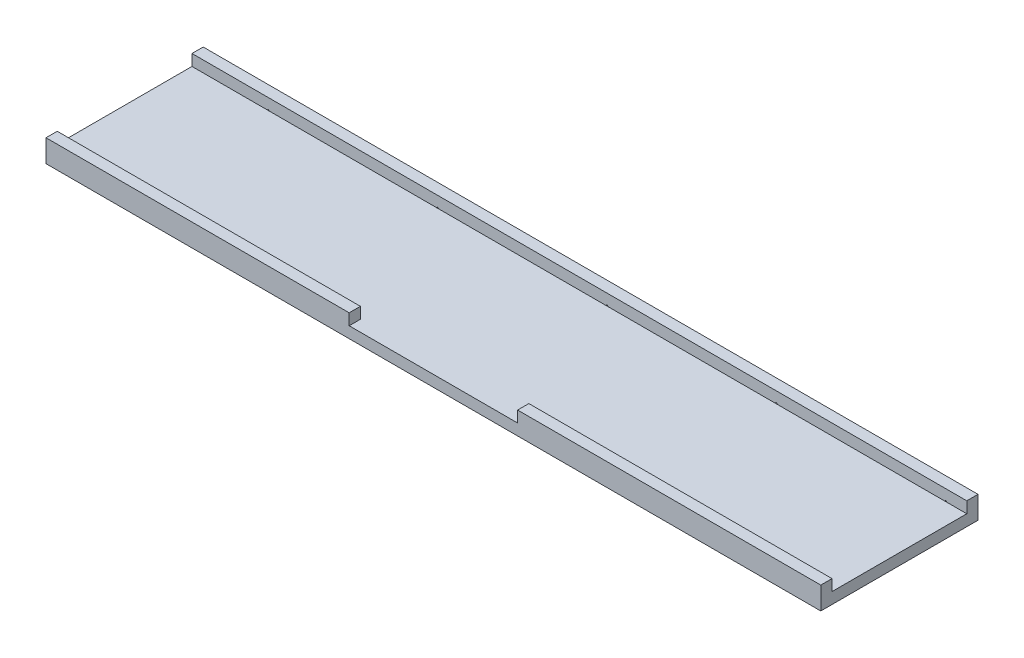
ISO-10303-21;
HEADER;
FILE_DESCRIPTION(('STEP AP214'),'2;1');
FILE_NAME('part.step','',(''),(''),'','','');
FILE_SCHEMA(('AUTOMOTIVE_DESIGN { 1 0 10303 214 1 1 1 1 }'));
ENDSEC;
DATA;
#1=APPLICATION_CONTEXT('core data for automotive mechanical design processes');
#2=APPLICATION_PROTOCOL_DEFINITION('international standard','automotive_design',2000,#1);
#3=PRODUCT_CONTEXT('',#1,'mechanical');
#4=PRODUCT('Part','Part','',(#3));
#5=PRODUCT_RELATED_PRODUCT_CATEGORY('part','',(#4));
#6=PRODUCT_DEFINITION_FORMATION('','',#4);
#7=PRODUCT_DEFINITION_CONTEXT('part definition',#1,'design');
#8=PRODUCT_DEFINITION('design','',#6,#7);
#9=PRODUCT_DEFINITION_SHAPE('','',#8);
#10=(LENGTH_UNIT() NAMED_UNIT(*) SI_UNIT(.MILLI.,.METRE.));
#11=(NAMED_UNIT(*) PLANE_ANGLE_UNIT() SI_UNIT($,.RADIAN.));
#12=(NAMED_UNIT(*) SI_UNIT($,.STERADIAN.) SOLID_ANGLE_UNIT());
#13=UNCERTAINTY_MEASURE_WITH_UNIT(LENGTH_MEASURE(1.E-05),#10,'distance_accuracy_value','');
#14=(GEOMETRIC_REPRESENTATION_CONTEXT(3) GLOBAL_UNCERTAINTY_ASSIGNED_CONTEXT((#13)) GLOBAL_UNIT_ASSIGNED_CONTEXT((#10,
#11,#12)) REPRESENTATION_CONTEXT('',''));
#15=CARTESIAN_POINT('',(0.,0.,0.));
#16=DIRECTION('',(0.,0.,1.));
#17=DIRECTION('',(1.,0.,0.));
#18=AXIS2_PLACEMENT_3D('',#15,#16,#17);
#19=CARTESIAN_POINT('',(0.,10.,-5.));
#20=DIRECTION('',(0.,0.,1.));
#21=DIRECTION('',(1.,0.,0.));
#22=AXIS2_PLACEMENT_3D('',#19,#20,#21);
#23=PLANE('',#22);
#24=DIRECTION('',(-1.,0.,0.));
#25=VECTOR('',#24,1.);
#26=CARTESIAN_POINT('',(0.,10.,-5.));
#27=LINE('',#26,#25);
#28=CARTESIAN_POINT('',(135.,10.,-5.));
#29=VERTEX_POINT('',#28);
#30=CARTESIAN_POINT('',(0.,10.,-5.));
#31=VERTEX_POINT('',#30);
#32=EDGE_CURVE('E379',#29,#31,#27,.T.);
#33=ORIENTED_EDGE('',*,*,#32,.F.);
#34=DIRECTION('',(0.,1.,0.));
#35=VECTOR('',#34,1.);
#36=CARTESIAN_POINT('',(135.,5.,-5.));
#37=LINE('',#36,#35);
#38=CARTESIAN_POINT('',(135.,5.,-5.));
#39=VERTEX_POINT('',#38);
#40=EDGE_CURVE('E352',#39,#29,#37,.T.);
#41=ORIENTED_EDGE('',*,*,#40,.F.);
#42=DIRECTION('',(-1.,0.,0.));
#43=VECTOR('',#42,1.);
#44=CARTESIAN_POINT('',(0.,5.,-5.));
#45=LINE('',#44,#43);
#46=CARTESIAN_POINT('',(0.,5.,-5.));
#47=VERTEX_POINT('',#46);
#48=EDGE_CURVE('E355',#39,#47,#45,.T.);
#49=ORIENTED_EDGE('',*,*,#48,.T.);
#50=DIRECTION('',(0.,-1.,0.));
#51=VECTOR('',#50,1.);
#52=CARTESIAN_POINT('',(0.,10.,-5.));
#53=LINE('',#52,#51);
#54=EDGE_CURVE('E213',#31,#47,#53,.T.);
#55=ORIENTED_EDGE('',*,*,#54,.F.);
#56=EDGE_LOOP('',(#33,#41,#49,#55));
#57=FACE_BOUND('',#56,.T.);
#58=ADVANCED_FACE('F38',(#57),#23,.F.);
#59=CARTESIAN_POINT('',(0.,10.,0.));
#60=DIRECTION('',(0.,-1.,0.));
#61=DIRECTION('',(0.,0.,-1.));
#62=AXIS2_PLACEMENT_3D('',#59,#60,#61);
#63=PLANE('',#62);
#64=DIRECTION('',(1.,0.,0.));
#65=VECTOR('',#64,1.);
#66=CARTESIAN_POINT('',(0.,10.,0.));
#67=LINE('',#66,#65);
#68=CARTESIAN_POINT('',(0.,10.,0.));
#69=VERTEX_POINT('',#68);
#70=CARTESIAN_POINT('',(135.,10.,0.));
#71=VERTEX_POINT('',#70);
#72=EDGE_CURVE('E372',#69,#71,#67,.T.);
#73=ORIENTED_EDGE('',*,*,#72,.T.);
#74=DIRECTION('',(0.,0.,1.));
#75=VECTOR('',#74,1.);
#76=CARTESIAN_POINT('',(135.,10.,-5.));
#77=LINE('',#76,#75);
#78=EDGE_CURVE('E347',#29,#71,#77,.T.);
#79=ORIENTED_EDGE('',*,*,#78,.F.);
#80=ORIENTED_EDGE('',*,*,#32,.T.);
#81=DIRECTION('',(0.,0.,1.));
#82=VECTOR('',#81,1.);
#83=CARTESIAN_POINT('',(0.,10.,0.));
#84=LINE('',#83,#82);
#85=EDGE_CURVE('E366',#31,#69,#84,.T.);
#86=ORIENTED_EDGE('',*,*,#85,.T.);
#87=EDGE_LOOP('',(#73,#79,#80,#86));
#88=FACE_BOUND('',#87,.T.);
#89=ADVANCED_FACE('F393',(#88),#63,.F.);
#90=CARTESIAN_POINT('',(0.,5.,0.));
#91=DIRECTION('',(0.,-1.,0.));
#92=DIRECTION('',(0.,0.,-1.));
#93=AXIS2_PLACEMENT_3D('',#90,#91,#92);
#94=PLANE('',#93);
#95=CARTESIAN_POINT('',(345.,5.,-5.));
#96=VERTEX_POINT('',#95);
#97=CARTESIAN_POINT('',(210.,5.,-5.));
#98=VERTEX_POINT('',#97);
#99=EDGE_CURVE('E371',#96,#98,#45,.T.);
#100=ORIENTED_EDGE('',*,*,#99,.F.);
#101=DIRECTION('',(0.,0.,-1.));
#102=VECTOR('',#101,1.);
#103=CARTESIAN_POINT('',(345.,5.,0.));
#104=LINE('',#103,#102);
#105=CARTESIAN_POINT('',(345.,5.,-65.));
#106=VERTEX_POINT('',#105);
#107=EDGE_CURVE('E248',#96,#106,#104,.T.);
#108=ORIENTED_EDGE('',*,*,#107,.T.);
#109=DIRECTION('',(1.,0.,0.));
#110=VECTOR('',#109,1.);
#111=CARTESIAN_POINT('',(0.,5.,-65.));
#112=LINE('',#111,#110);
#113=CARTESIAN_POINT('',(336.,5.,-65.));
#114=VERTEX_POINT('',#113);
#115=EDGE_CURVE('E196',#114,#106,#112,.T.);
#116=ORIENTED_EDGE('',*,*,#115,.F.);
#117=CARTESIAN_POINT('',(335.2,5.,-65.));
#118=VERTEX_POINT('',#117);
#119=EDGE_CURVE('E204',#118,#114,#112,.T.);
#120=ORIENTED_EDGE('',*,*,#119,.F.);
#121=CARTESIAN_POINT('',(260.6,5.,-65.));
#122=VERTEX_POINT('',#121);
#123=EDGE_CURVE('E211',#122,#118,#112,.T.);
#124=ORIENTED_EDGE('',*,*,#123,.F.);
#125=CARTESIAN_POINT('',(259.8,5.,-65.));
#126=VERTEX_POINT('',#125);
#127=EDGE_CURVE('E292',#126,#122,#112,.T.);
#128=ORIENTED_EDGE('',*,*,#127,.F.);
#129=CARTESIAN_POINT('',(185.2,5.,-65.));
#130=VERTEX_POINT('',#129);
#131=EDGE_CURVE('E289',#130,#126,#112,.T.);
#132=ORIENTED_EDGE('',*,*,#131,.F.);
#133=CARTESIAN_POINT('',(184.4,5.,-65.));
#134=VERTEX_POINT('',#133);
#135=EDGE_CURVE('E297',#134,#130,#112,.T.);
#136=ORIENTED_EDGE('',*,*,#135,.F.);
#137=CARTESIAN_POINT('',(109.8,5.,-65.));
#138=VERTEX_POINT('',#137);
#139=EDGE_CURVE('E300',#138,#134,#112,.T.);
#140=ORIENTED_EDGE('',*,*,#139,.F.);
#141=CARTESIAN_POINT('',(109.,5.,-65.));
#142=VERTEX_POINT('',#141);
#143=EDGE_CURVE('E306',#142,#138,#112,.T.);
#144=ORIENTED_EDGE('',*,*,#143,.F.);
#145=CARTESIAN_POINT('',(34.4,5.,-65.));
#146=VERTEX_POINT('',#145);
#147=EDGE_CURVE('E186',#146,#142,#112,.T.);
#148=ORIENTED_EDGE('',*,*,#147,.F.);
#149=CARTESIAN_POINT('',(33.6,5.,-65.));
#150=VERTEX_POINT('',#149);
#151=EDGE_CURVE('E174',#150,#146,#112,.T.);
#152=ORIENTED_EDGE('',*,*,#151,.F.);
#153=CARTESIAN_POINT('',(0.,5.,-65.));
#154=VERTEX_POINT('',#153);
#155=EDGE_CURVE('E183',#154,#150,#112,.T.);
#156=ORIENTED_EDGE('',*,*,#155,.F.);
#157=DIRECTION('',(0.,0.,1.));
#158=VECTOR('',#157,1.);
#159=CARTESIAN_POINT('',(0.,5.,0.));
#160=LINE('',#159,#158);
#161=EDGE_CURVE('E245',#154,#47,#160,.T.);
#162=ORIENTED_EDGE('',*,*,#161,.T.);
#163=ORIENTED_EDGE('',*,*,#48,.F.);
#164=DIRECTION('',(0.,0.,1.));
#165=VECTOR('',#164,1.);
#166=CARTESIAN_POINT('',(135.,5.,-5.));
#167=LINE('',#166,#165);
#168=CARTESIAN_POINT('',(135.,5.,0.));
#169=VERTEX_POINT('',#168);
#170=EDGE_CURVE('E333',#39,#169,#167,.T.);
#171=ORIENTED_EDGE('',*,*,#170,.T.);
#172=DIRECTION('',(1.,0.,0.));
#173=VECTOR('',#172,1.);
#174=CARTESIAN_POINT('',(135.,5.,0.));
#175=LINE('',#174,#173);
#176=CARTESIAN_POINT('',(210.,5.,0.));
#177=VERTEX_POINT('',#176);
#178=EDGE_CURVE('E337',#169,#177,#175,.T.);
#179=ORIENTED_EDGE('',*,*,#178,.T.);
#180=DIRECTION('',(0.,0.,-1.));
#181=VECTOR('',#180,1.);
#182=CARTESIAN_POINT('',(210.,5.,-5.));
#183=LINE('',#182,#181);
#184=EDGE_CURVE('E342',#177,#98,#183,.T.);
#185=ORIENTED_EDGE('',*,*,#184,.T.);
#186=EDGE_LOOP('',(#100,#108,#116,#120,#124,#128,#132,#136,#140,#144,#148,#152,#156,#162,#163,
#171,#179,#185));
#187=FACE_BOUND('',#186,.T.);
#188=ADVANCED_FACE('F181',(#187),#94,.F.);
#189=CARTESIAN_POINT('',(0.,5.,0.));
#190=DIRECTION('',(1.,0.,0.));
#191=DIRECTION('',(0.,0.,-1.));
#192=AXIS2_PLACEMENT_3D('',#189,#190,#191);
#193=PLANE('',#192);
#194=DIRECTION('',(0.,0.,1.));
#195=VECTOR('',#194,1.);
#196=CARTESIAN_POINT('',(0.,0.,0.));
#197=LINE('',#196,#195);
#198=CARTESIAN_POINT('',(0.,0.,-70.));
#199=VERTEX_POINT('',#198);
#200=CARTESIAN_POINT('',(0.,0.,0.));
#201=VERTEX_POINT('',#200);
#202=EDGE_CURVE('E242',#199,#201,#197,.T.);
#203=ORIENTED_EDGE('',*,*,#202,.T.);
#204=DIRECTION('',(0.,-1.,0.));
#205=VECTOR('',#204,1.);
#206=CARTESIAN_POINT('',(0.,5.,0.));
#207=LINE('',#206,#205);
#208=EDGE_CURVE('E169',#69,#201,#207,.T.);
#209=ORIENTED_EDGE('',*,*,#208,.F.);
#210=ORIENTED_EDGE('',*,*,#85,.F.);
#211=ORIENTED_EDGE('',*,*,#54,.T.);
#212=ORIENTED_EDGE('',*,*,#161,.F.);
#213=DIRECTION('',(0.,-1.,0.));
#214=VECTOR('',#213,1.);
#215=CARTESIAN_POINT('',(0.,10.,-65.));
#216=LINE('',#215,#214);
#217=CARTESIAN_POINT('',(0.,10.,-65.));
#218=VERTEX_POINT('',#217);
#219=EDGE_CURVE('E193',#218,#154,#216,.T.);
#220=ORIENTED_EDGE('',*,*,#219,.F.);
#221=DIRECTION('',(0.,0.,1.));
#222=VECTOR('',#221,1.);
#223=CARTESIAN_POINT('',(0.,10.,-70.));
#224=LINE('',#223,#222);
#225=CARTESIAN_POINT('',(0.,10.,-70.));
#226=VERTEX_POINT('',#225);
#227=EDGE_CURVE('E195',#226,#218,#224,.T.);
#228=ORIENTED_EDGE('',*,*,#227,.F.);
#229=DIRECTION('',(0.,-1.,0.));
#230=VECTOR('',#229,1.);
#231=CARTESIAN_POINT('',(0.,5.,-70.));
#232=LINE('',#231,#230);
#233=EDGE_CURVE('E252',#226,#199,#232,.T.);
#234=ORIENTED_EDGE('',*,*,#233,.T.);
#235=EDGE_LOOP('',(#203,#209,#210,#211,#212,#220,#228,#234));
#236=FACE_BOUND('',#235,.T.);
#237=ADVANCED_FACE('F40',(#236),#193,.F.);
#238=CARTESIAN_POINT('',(0.,5.,0.));
#239=DIRECTION('',(0.,0.,-1.));
#240=DIRECTION('',(-1.,0.,0.));
#241=AXIS2_PLACEMENT_3D('',#238,#239,#240);
#242=PLANE('',#241);
#243=ORIENTED_EDGE('',*,*,#178,.F.);
#244=DIRECTION('',(0.,1.,0.));
#245=VECTOR('',#244,1.);
#246=CARTESIAN_POINT('',(135.,5.,0.));
#247=LINE('',#246,#245);
#248=EDGE_CURVE('E346',#169,#71,#247,.T.);
#249=ORIENTED_EDGE('',*,*,#248,.T.);
#250=ORIENTED_EDGE('',*,*,#72,.F.);
#251=ORIENTED_EDGE('',*,*,#208,.T.);
#252=DIRECTION('',(1.,0.,0.));
#253=VECTOR('',#252,1.);
#254=CARTESIAN_POINT('',(0.,0.,0.));
#255=LINE('',#254,#253);
#256=CARTESIAN_POINT('',(345.,0.,0.));
#257=VERTEX_POINT('',#256);
#258=EDGE_CURVE('E256',#201,#257,#255,.T.);
#259=ORIENTED_EDGE('',*,*,#258,.T.);
#260=DIRECTION('',(0.,-1.,0.));
#261=VECTOR('',#260,1.);
#262=CARTESIAN_POINT('',(345.,5.,0.));
#263=LINE('',#262,#261);
#264=CARTESIAN_POINT('',(345.,10.,0.));
#265=VERTEX_POINT('',#264);
#266=EDGE_CURVE('E271',#265,#257,#263,.T.);
#267=ORIENTED_EDGE('',*,*,#266,.F.);
#268=CARTESIAN_POINT('',(210.,10.,0.));
#269=VERTEX_POINT('',#268);
#270=EDGE_CURVE('E370',#269,#265,#67,.T.);
#271=ORIENTED_EDGE('',*,*,#270,.F.);
#272=DIRECTION('',(0.,1.,0.));
#273=VECTOR('',#272,1.);
#274=CARTESIAN_POINT('',(210.,5.,0.));
#275=LINE('',#274,#273);
#276=EDGE_CURVE('E360',#177,#269,#275,.T.);
#277=ORIENTED_EDGE('',*,*,#276,.F.);
#278=EDGE_LOOP('',(#243,#249,#250,#251,#259,#267,#271,#277));
#279=FACE_BOUND('',#278,.T.);
#280=ADVANCED_FACE('F406',(#279),#242,.F.);
#281=CARTESIAN_POINT('',(345.,5.,0.));
#282=DIRECTION('',(-1.,0.,0.));
#283=DIRECTION('',(0.,0.,1.));
#284=AXIS2_PLACEMENT_3D('',#281,#282,#283);
#285=PLANE('',#284);
#286=DIRECTION('',(0.,0.,-1.));
#287=VECTOR('',#286,1.);
#288=CARTESIAN_POINT('',(345.,0.,0.));
#289=LINE('',#288,#287);
#290=CARTESIAN_POINT('',(345.,0.,-70.));
#291=VERTEX_POINT('',#290);
#292=EDGE_CURVE('E259',#257,#291,#289,.T.);
#293=ORIENTED_EDGE('',*,*,#292,.T.);
#294=DIRECTION('',(0.,-1.,0.));
#295=VECTOR('',#294,1.);
#296=CARTESIAN_POINT('',(345.,5.,-70.));
#297=LINE('',#296,#295);
#298=CARTESIAN_POINT('',(345.,10.,-70.));
#299=VERTEX_POINT('',#298);
#300=EDGE_CURVE('E267',#299,#291,#297,.T.);
#301=ORIENTED_EDGE('',*,*,#300,.F.);
#302=DIRECTION('',(0.,0.,-1.));
#303=VECTOR('',#302,1.);
#304=CARTESIAN_POINT('',(345.,10.,-70.));
#305=LINE('',#304,#303);
#306=CARTESIAN_POINT('',(345.,10.,-65.));
#307=VERTEX_POINT('',#306);
#308=EDGE_CURVE('E227',#307,#299,#305,.T.);
#309=ORIENTED_EDGE('',*,*,#308,.F.);
#310=DIRECTION('',(0.,-1.,0.));
#311=VECTOR('',#310,1.);
#312=CARTESIAN_POINT('',(345.,10.,-65.));
#313=LINE('',#312,#311);
#314=EDGE_CURVE('E233',#307,#106,#313,.T.);
#315=ORIENTED_EDGE('',*,*,#314,.T.);
#316=ORIENTED_EDGE('',*,*,#107,.F.);
#317=DIRECTION('',(0.,-1.,0.));
#318=VECTOR('',#317,1.);
#319=CARTESIAN_POINT('',(345.,10.,-5.));
#320=LINE('',#319,#318);
#321=CARTESIAN_POINT('',(345.,10.,-5.));
#322=VERTEX_POINT('',#321);
#323=EDGE_CURVE('E205',#322,#96,#320,.T.);
#324=ORIENTED_EDGE('',*,*,#323,.F.);
#325=DIRECTION('',(0.,0.,-1.));
#326=VECTOR('',#325,1.);
#327=CARTESIAN_POINT('',(345.,10.,0.));
#328=LINE('',#327,#326);
#329=EDGE_CURVE('E376',#265,#322,#328,.T.);
#330=ORIENTED_EDGE('',*,*,#329,.F.);
#331=ORIENTED_EDGE('',*,*,#266,.T.);
#332=EDGE_LOOP('',(#293,#301,#309,#315,#316,#324,#330,#331));
#333=FACE_BOUND('',#332,.T.);
#334=ADVANCED_FACE('F408',(#333),#285,.F.);
#335=CARTESIAN_POINT('',(0.,5.,-70.));
#336=DIRECTION('',(0.,0.,1.));
#337=DIRECTION('',(1.,0.,0.));
#338=AXIS2_PLACEMENT_3D('',#335,#336,#337);
#339=PLANE('',#338);
#340=CARTESIAN_POINT('',(335.6,5.,-70.));
#341=DIRECTION('',(0.,0.,-1.));
#342=DIRECTION('',(-1.,0.,0.));
#343=AXIS2_PLACEMENT_3D('',#340,#341,#342);
#344=CIRCLE('',#343,0.400000000000032);
#345=CARTESIAN_POINT('',(335.2,5.,-70.));
#346=VERTEX_POINT('',#345);
#347=EDGE_CURVE('E593',#346,#346,#344,.T.);
#348=ORIENTED_EDGE('',*,*,#347,.F.);
#349=EDGE_LOOP('',(#348));
#350=FACE_BOUND('',#349,.T.);
#351=CARTESIAN_POINT('',(260.2,5.,-70.));
#352=DIRECTION('',(0.,0.,-1.));
#353=DIRECTION('',(-1.,0.,0.));
#354=AXIS2_PLACEMENT_3D('',#351,#352,#353);
#355=CIRCLE('',#354,0.399999999999974);
#356=CARTESIAN_POINT('',(259.8,5.,-70.));
#357=VERTEX_POINT('',#356);
#358=EDGE_CURVE('E599',#357,#357,#355,.T.);
#359=ORIENTED_EDGE('',*,*,#358,.F.);
#360=EDGE_LOOP('',(#359));
#361=FACE_BOUND('',#360,.T.);
#362=CARTESIAN_POINT('',(184.8,5.,-70.));
#363=DIRECTION('',(0.,0.,-1.));
#364=DIRECTION('',(-1.,0.,0.));
#365=AXIS2_PLACEMENT_3D('',#362,#363,#364);
#366=CIRCLE('',#365,0.400000000000006);
#367=CARTESIAN_POINT('',(184.4,5.,-70.));
#368=VERTEX_POINT('',#367);
#369=EDGE_CURVE('E319',#368,#368,#366,.T.);
#370=ORIENTED_EDGE('',*,*,#369,.F.);
#371=EDGE_LOOP('',(#370));
#372=FACE_BOUND('',#371,.T.);
#373=CARTESIAN_POINT('',(109.4,5.,-70.));
#374=DIRECTION('',(0.,0.,-1.));
#375=DIRECTION('',(-1.,0.,0.));
#376=AXIS2_PLACEMENT_3D('',#373,#374,#375);
#377=CIRCLE('',#376,0.400000000000006);
#378=CARTESIAN_POINT('',(109.,5.,-70.));
#379=VERTEX_POINT('',#378);
#380=EDGE_CURVE('E176',#379,#379,#377,.T.);
#381=ORIENTED_EDGE('',*,*,#380,.F.);
#382=EDGE_LOOP('',(#381));
#383=FACE_BOUND('',#382,.T.);
#384=CARTESIAN_POINT('',(34.,5.,-70.));
#385=DIRECTION('',(0.,0.,-1.));
#386=DIRECTION('',(-1.,0.,0.));
#387=AXIS2_PLACEMENT_3D('',#384,#385,#386);
#388=CIRCLE('',#387,0.400000000000005);
#389=CARTESIAN_POINT('',(33.6,5.,-70.));
#390=VERTEX_POINT('',#389);
#391=EDGE_CURVE('E177',#390,#390,#388,.T.);
#392=ORIENTED_EDGE('',*,*,#391,.F.);
#393=EDGE_LOOP('',(#392));
#394=FACE_BOUND('',#393,.T.);
#395=DIRECTION('',(-1.,0.,0.));
#396=VECTOR('',#395,1.);
#397=CARTESIAN_POINT('',(0.,0.,-70.));
#398=LINE('',#397,#396);
#399=EDGE_CURVE('E249',#291,#199,#398,.T.);
#400=ORIENTED_EDGE('',*,*,#399,.T.);
#401=ORIENTED_EDGE('',*,*,#233,.F.);
#402=DIRECTION('',(-1.,0.,0.));
#403=VECTOR('',#402,1.);
#404=CARTESIAN_POINT('',(0.,10.,-70.));
#405=LINE('',#404,#403);
#406=EDGE_CURVE('E230',#299,#226,#405,.T.);
#407=ORIENTED_EDGE('',*,*,#406,.F.);
#408=ORIENTED_EDGE('',*,*,#300,.T.);
#409=EDGE_LOOP('',(#400,#401,#407,#408));
#410=FACE_BOUND('',#409,.T.);
#411=ADVANCED_FACE('F444',(#350,#361,#372,#383,#394,#410),#339,.F.);
#412=CARTESIAN_POINT('',(0.,0.,0.));
#413=DIRECTION('',(0.,-1.,0.));
#414=DIRECTION('',(0.,0.,-1.));
#415=AXIS2_PLACEMENT_3D('',#412,#413,#414);
#416=PLANE('',#415);
#417=ORIENTED_EDGE('',*,*,#202,.F.);
#418=ORIENTED_EDGE('',*,*,#399,.F.);
#419=ORIENTED_EDGE('',*,*,#292,.F.);
#420=ORIENTED_EDGE('',*,*,#258,.F.);
#421=EDGE_LOOP('',(#417,#418,#419,#420));
#422=FACE_BOUND('',#421,.T.);
#423=ADVANCED_FACE('F437',(#422),#416,.T.);
#424=CARTESIAN_POINT('',(0.,10.,-65.));
#425=DIRECTION('',(0.,0.,-1.));
#426=DIRECTION('',(-1.,0.,0.));
#427=AXIS2_PLACEMENT_3D('',#424,#425,#426);
#428=PLANE('',#427);
#429=ORIENTED_EDGE('',*,*,#123,.T.);
#430=CARTESIAN_POINT('',(335.6,5.,-65.));
#431=DIRECTION('',(0.,0.,-1.));
#432=DIRECTION('',(-1.,0.,0.));
#433=AXIS2_PLACEMENT_3D('',#430,#431,#432);
#434=CIRCLE('',#433,0.400000000000032);
#435=EDGE_CURVE('E11',#118,#114,#434,.T.);
#436=ORIENTED_EDGE('',*,*,#435,.T.);
#437=ORIENTED_EDGE('',*,*,#115,.T.);
#438=ORIENTED_EDGE('',*,*,#314,.F.);
#439=DIRECTION('',(1.,0.,0.));
#440=VECTOR('',#439,1.);
#441=CARTESIAN_POINT('',(0.,10.,-65.));
#442=LINE('',#441,#440);
#443=EDGE_CURVE('E199',#218,#307,#442,.T.);
#444=ORIENTED_EDGE('',*,*,#443,.F.);
#445=ORIENTED_EDGE('',*,*,#219,.T.);
#446=ORIENTED_EDGE('',*,*,#155,.T.);
#447=CARTESIAN_POINT('',(34.,5.,-65.));
#448=DIRECTION('',(0.,0.,-1.));
#449=DIRECTION('',(-1.,0.,0.));
#450=AXIS2_PLACEMENT_3D('',#447,#448,#449);
#451=CIRCLE('',#450,0.400000000000005);
#452=EDGE_CURVE('E157',#150,#146,#451,.T.);
#453=ORIENTED_EDGE('',*,*,#452,.T.);
#454=ORIENTED_EDGE('',*,*,#147,.T.);
#455=CARTESIAN_POINT('',(109.4,5.,-65.));
#456=DIRECTION('',(0.,0.,-1.));
#457=DIRECTION('',(-1.,0.,0.));
#458=AXIS2_PLACEMENT_3D('',#455,#456,#457);
#459=CIRCLE('',#458,0.400000000000006);
#460=EDGE_CURVE('E168',#142,#138,#459,.T.);
#461=ORIENTED_EDGE('',*,*,#460,.T.);
#462=ORIENTED_EDGE('',*,*,#139,.T.);
#463=CARTESIAN_POINT('',(184.8,5.,-65.));
#464=DIRECTION('',(0.,0.,-1.));
#465=DIRECTION('',(-1.,0.,0.));
#466=AXIS2_PLACEMENT_3D('',#463,#464,#465);
#467=CIRCLE('',#466,0.400000000000006);
#468=EDGE_CURVE('E281',#134,#130,#467,.T.);
#469=ORIENTED_EDGE('',*,*,#468,.T.);
#470=ORIENTED_EDGE('',*,*,#131,.T.);
#471=CARTESIAN_POINT('',(260.2,5.,-65.));
#472=DIRECTION('',(0.,0.,-1.));
#473=DIRECTION('',(-1.,0.,0.));
#474=AXIS2_PLACEMENT_3D('',#471,#472,#473);
#475=CIRCLE('',#474,0.399999999999974);
#476=EDGE_CURVE('E47',#126,#122,#475,.T.);
#477=ORIENTED_EDGE('',*,*,#476,.T.);
#478=EDGE_LOOP('',(#429,#436,#437,#438,#444,#445,#446,#453,#454,#461,#462,#469,#470,#477));
#479=FACE_BOUND('',#478,.T.);
#480=ADVANCED_FACE('F191',(#479),#428,.F.);
#481=CARTESIAN_POINT('',(0.,10.,0.));
#482=DIRECTION('',(0.,1.,0.));
#483=DIRECTION('',(0.,0.,1.));
#484=AXIS2_PLACEMENT_3D('',#481,#482,#483);
#485=PLANE('',#484);
#486=ORIENTED_EDGE('',*,*,#227,.T.);
#487=ORIENTED_EDGE('',*,*,#443,.T.);
#488=ORIENTED_EDGE('',*,*,#308,.T.);
#489=ORIENTED_EDGE('',*,*,#406,.T.);
#490=EDGE_LOOP('',(#486,#487,#488,#489));
#491=FACE_BOUND('',#490,.T.);
#492=ADVANCED_FACE('F429',(#491),#485,.T.);
#493=ORIENTED_EDGE('',*,*,#99,.T.);
#494=DIRECTION('',(0.,1.,0.));
#495=VECTOR('',#494,1.);
#496=CARTESIAN_POINT('',(210.,5.,-5.));
#497=LINE('',#496,#495);
#498=CARTESIAN_POINT('',(210.,10.,-5.));
#499=VERTEX_POINT('',#498);
#500=EDGE_CURVE('E356',#98,#499,#497,.T.);
#501=ORIENTED_EDGE('',*,*,#500,.T.);
#502=EDGE_CURVE('E221',#322,#499,#27,.T.);
#503=ORIENTED_EDGE('',*,*,#502,.F.);
#504=ORIENTED_EDGE('',*,*,#323,.T.);
#505=EDGE_LOOP('',(#493,#501,#503,#504));
#506=FACE_BOUND('',#505,.T.);
#507=ADVANCED_FACE('F409',(#506),#23,.F.);
#508=ORIENTED_EDGE('',*,*,#502,.T.);
#509=DIRECTION('',(0.,0.,-1.));
#510=VECTOR('',#509,1.);
#511=CARTESIAN_POINT('',(210.,10.,-5.));
#512=LINE('',#511,#510);
#513=EDGE_CURVE('E338',#269,#499,#512,.T.);
#514=ORIENTED_EDGE('',*,*,#513,.F.);
#515=ORIENTED_EDGE('',*,*,#270,.T.);
#516=ORIENTED_EDGE('',*,*,#329,.T.);
#517=EDGE_LOOP('',(#508,#514,#515,#516));
#518=FACE_BOUND('',#517,.T.);
#519=ADVANCED_FACE('F401',(#518),#63,.F.);
#520=CARTESIAN_POINT('',(135.,5.,-5.));
#521=DIRECTION('',(-1.,0.,0.));
#522=DIRECTION('',(0.,0.,1.));
#523=AXIS2_PLACEMENT_3D('',#520,#521,#522);
#524=PLANE('',#523);
#525=ORIENTED_EDGE('',*,*,#78,.T.);
#526=ORIENTED_EDGE('',*,*,#248,.F.);
#527=ORIENTED_EDGE('',*,*,#170,.F.);
#528=ORIENTED_EDGE('',*,*,#40,.T.);
#529=EDGE_LOOP('',(#525,#526,#527,#528));
#530=FACE_BOUND('',#529,.T.);
#531=ADVANCED_FACE('F413',(#530),#524,.F.);
#532=CARTESIAN_POINT('',(210.,5.,-5.));
#533=DIRECTION('',(1.,0.,0.));
#534=DIRECTION('',(0.,0.,-1.));
#535=AXIS2_PLACEMENT_3D('',#532,#533,#534);
#536=PLANE('',#535);
#537=ORIENTED_EDGE('',*,*,#513,.T.);
#538=ORIENTED_EDGE('',*,*,#500,.F.);
#539=ORIENTED_EDGE('',*,*,#184,.F.);
#540=ORIENTED_EDGE('',*,*,#276,.T.);
#541=EDGE_LOOP('',(#537,#538,#539,#540));
#542=FACE_BOUND('',#541,.T.);
#543=ADVANCED_FACE('F411',(#542),#536,.F.);
#544=CARTESIAN_POINT('',(0.,10.,-65.));
#545=DIRECTION('',(0.,0.,-1.));
#546=DIRECTION('',(-1.,0.,0.));
#547=AXIS2_PLACEMENT_3D('',#544,#545,#546);
#548=PLANE('',#547);
#549=ORIENTED_EDGE('',*,*,#151,.T.);
#550=CARTESIAN_POINT('',(34.,5.,-65.));
#551=DIRECTION('',(0.,0.,-1.));
#552=DIRECTION('',(-1.,0.,0.));
#553=AXIS2_PLACEMENT_3D('',#550,#551,#552);
#554=CIRCLE('',#553,0.400000000000005);
#555=EDGE_CURVE('E161',#150,#146,#554,.F.);
#556=ORIENTED_EDGE('',*,*,#555,.F.);
#557=EDGE_LOOP('',(#549,#556));
#558=FACE_BOUND('',#557,.T.);
#559=ADVANCED_FACE('F173',(#558),#548,.T.);
#560=CARTESIAN_POINT('',(34.,5.,-63.8686291501015));
#561=DIRECTION('',(0.,0.,-1.));
#562=DIRECTION('',(-1.,0.,0.));
#563=AXIS2_PLACEMENT_3D('',#560,#561,#562);
#564=CYLINDRICAL_SURFACE('',#563,0.400000000000005);
#565=ORIENTED_EDGE('',*,*,#555,.T.);
#566=ORIENTED_EDGE('',*,*,#452,.F.);
#567=EDGE_LOOP('',(#565,#566));
#568=FACE_BOUND('',#567,.T.);
#569=ORIENTED_EDGE('',*,*,#391,.T.);
#570=EDGE_LOOP('',(#569));
#571=FACE_BOUND('',#570,.T.);
#572=ADVANCED_FACE('F159',(#568,#571),#564,.F.);
#573=CARTESIAN_POINT('',(0.,10.,-65.));
#574=DIRECTION('',(0.,0.,-1.));
#575=DIRECTION('',(-1.,0.,0.));
#576=AXIS2_PLACEMENT_3D('',#573,#574,#575);
#577=PLANE('',#576);
#578=ORIENTED_EDGE('',*,*,#143,.T.);
#579=CARTESIAN_POINT('',(109.4,5.,-65.));
#580=DIRECTION('',(0.,0.,-1.));
#581=DIRECTION('',(-1.,0.,0.));
#582=AXIS2_PLACEMENT_3D('',#579,#580,#581);
#583=CIRCLE('',#582,0.400000000000006);
#584=EDGE_CURVE('E316',#142,#138,#583,.F.);
#585=ORIENTED_EDGE('',*,*,#584,.F.);
#586=EDGE_LOOP('',(#578,#585));
#587=FACE_BOUND('',#586,.T.);
#588=ADVANCED_FACE('F317',(#587),#577,.T.);
#589=CARTESIAN_POINT('',(109.4,5.,-63.8686291501015));
#590=DIRECTION('',(0.,0.,-1.));
#591=DIRECTION('',(-1.,0.,0.));
#592=AXIS2_PLACEMENT_3D('',#589,#590,#591);
#593=CYLINDRICAL_SURFACE('',#592,0.400000000000006);
#594=ORIENTED_EDGE('',*,*,#584,.T.);
#595=ORIENTED_EDGE('',*,*,#460,.F.);
#596=EDGE_LOOP('',(#594,#595));
#597=FACE_BOUND('',#596,.T.);
#598=ORIENTED_EDGE('',*,*,#380,.T.);
#599=EDGE_LOOP('',(#598));
#600=FACE_BOUND('',#599,.T.);
#601=ADVANCED_FACE('F314',(#597,#600),#593,.F.);
#602=CARTESIAN_POINT('',(0.,10.,-65.));
#603=DIRECTION('',(0.,0.,-1.));
#604=DIRECTION('',(-1.,0.,0.));
#605=AXIS2_PLACEMENT_3D('',#602,#603,#604);
#606=PLANE('',#605);
#607=ORIENTED_EDGE('',*,*,#135,.T.);
#608=CARTESIAN_POINT('',(184.8,5.,-65.));
#609=DIRECTION('',(0.,0.,-1.));
#610=DIRECTION('',(-1.,0.,0.));
#611=AXIS2_PLACEMENT_3D('',#608,#609,#610);
#612=CIRCLE('',#611,0.400000000000006);
#613=EDGE_CURVE('E324',#134,#130,#612,.F.);
#614=ORIENTED_EDGE('',*,*,#613,.F.);
#615=EDGE_LOOP('',(#607,#614));
#616=FACE_BOUND('',#615,.T.);
#617=ADVANCED_FACE('F524',(#616),#606,.T.);
#618=CARTESIAN_POINT('',(184.8,5.,-63.8686291501015));
#619=DIRECTION('',(0.,0.,-1.));
#620=DIRECTION('',(-1.,0.,0.));
#621=AXIS2_PLACEMENT_3D('',#618,#619,#620);
#622=CYLINDRICAL_SURFACE('',#621,0.400000000000006);
#623=ORIENTED_EDGE('',*,*,#613,.T.);
#624=ORIENTED_EDGE('',*,*,#468,.F.);
#625=EDGE_LOOP('',(#623,#624));
#626=FACE_BOUND('',#625,.T.);
#627=ORIENTED_EDGE('',*,*,#369,.T.);
#628=EDGE_LOOP('',(#627));
#629=FACE_BOUND('',#628,.T.);
#630=ADVANCED_FACE('F531',(#626,#629),#622,.F.);
#631=CARTESIAN_POINT('',(0.,10.,-65.));
#632=DIRECTION('',(0.,0.,-1.));
#633=DIRECTION('',(-1.,0.,0.));
#634=AXIS2_PLACEMENT_3D('',#631,#632,#633);
#635=PLANE('',#634);
#636=ORIENTED_EDGE('',*,*,#127,.T.);
#637=CARTESIAN_POINT('',(260.2,5.,-65.));
#638=DIRECTION('',(0.,0.,-1.));
#639=DIRECTION('',(-1.,0.,0.));
#640=AXIS2_PLACEMENT_3D('',#637,#638,#639);
#641=CIRCLE('',#640,0.399999999999974);
#642=EDGE_CURVE('E60',#126,#122,#641,.F.);
#643=ORIENTED_EDGE('',*,*,#642,.F.);
#644=EDGE_LOOP('',(#636,#643));
#645=FACE_BOUND('',#644,.T.);
#646=ADVANCED_FACE('F538',(#645),#635,.T.);
#647=CARTESIAN_POINT('',(260.2,5.,-63.8686291501015));
#648=DIRECTION('',(0.,0.,-1.));
#649=DIRECTION('',(-1.,0.,0.));
#650=AXIS2_PLACEMENT_3D('',#647,#648,#649);
#651=CYLINDRICAL_SURFACE('',#650,0.399999999999974);
#652=ORIENTED_EDGE('',*,*,#642,.T.);
#653=ORIENTED_EDGE('',*,*,#476,.F.);
#654=EDGE_LOOP('',(#652,#653));
#655=FACE_BOUND('',#654,.T.);
#656=ORIENTED_EDGE('',*,*,#358,.T.);
#657=EDGE_LOOP('',(#656));
#658=FACE_BOUND('',#657,.T.);
#659=ADVANCED_FACE('F546',(#655,#658),#651,.F.);
#660=CARTESIAN_POINT('',(0.,10.,-65.));
#661=DIRECTION('',(0.,0.,-1.));
#662=DIRECTION('',(-1.,0.,0.));
#663=AXIS2_PLACEMENT_3D('',#660,#661,#662);
#664=PLANE('',#663);
#665=ORIENTED_EDGE('',*,*,#119,.T.);
#666=CARTESIAN_POINT('',(335.6,5.,-65.));
#667=DIRECTION('',(0.,0.,-1.));
#668=DIRECTION('',(-1.,0.,0.));
#669=AXIS2_PLACEMENT_3D('',#666,#667,#668);
#670=CIRCLE('',#669,0.400000000000032);
#671=EDGE_CURVE('E53',#118,#114,#670,.F.);
#672=ORIENTED_EDGE('',*,*,#671,.F.);
#673=EDGE_LOOP('',(#665,#672));
#674=FACE_BOUND('',#673,.T.);
#675=ADVANCED_FACE('F553',(#674),#664,.T.);
#676=CARTESIAN_POINT('',(335.6,5.,-63.8686291501015));
#677=DIRECTION('',(0.,0.,-1.));
#678=DIRECTION('',(-1.,0.,0.));
#679=AXIS2_PLACEMENT_3D('',#676,#677,#678);
#680=CYLINDRICAL_SURFACE('',#679,0.400000000000032);
#681=ORIENTED_EDGE('',*,*,#671,.T.);
#682=ORIENTED_EDGE('',*,*,#435,.F.);
#683=EDGE_LOOP('',(#681,#682));
#684=FACE_BOUND('',#683,.T.);
#685=ORIENTED_EDGE('',*,*,#347,.T.);
#686=EDGE_LOOP('',(#685));
#687=FACE_BOUND('',#686,.T.);
#688=ADVANCED_FACE('F560',(#684,#687),#680,.F.);
#689=CLOSED_SHELL('',(#58,#89,#188,#237,#280,#334,#411,#423,#480,#492,#507,#519,#531,#543,#559,
#572,#588,#601,#617,#630,#646,#659,#675,#688));
#690=MANIFOLD_SOLID_BREP('B2',#689);
#691=ADVANCED_BREP_SHAPE_REPRESENTATION('',(#18,#690),#14);
#692=SHAPE_DEFINITION_REPRESENTATION(#9,#691);
ENDSEC;
END-ISO-10303-21;
